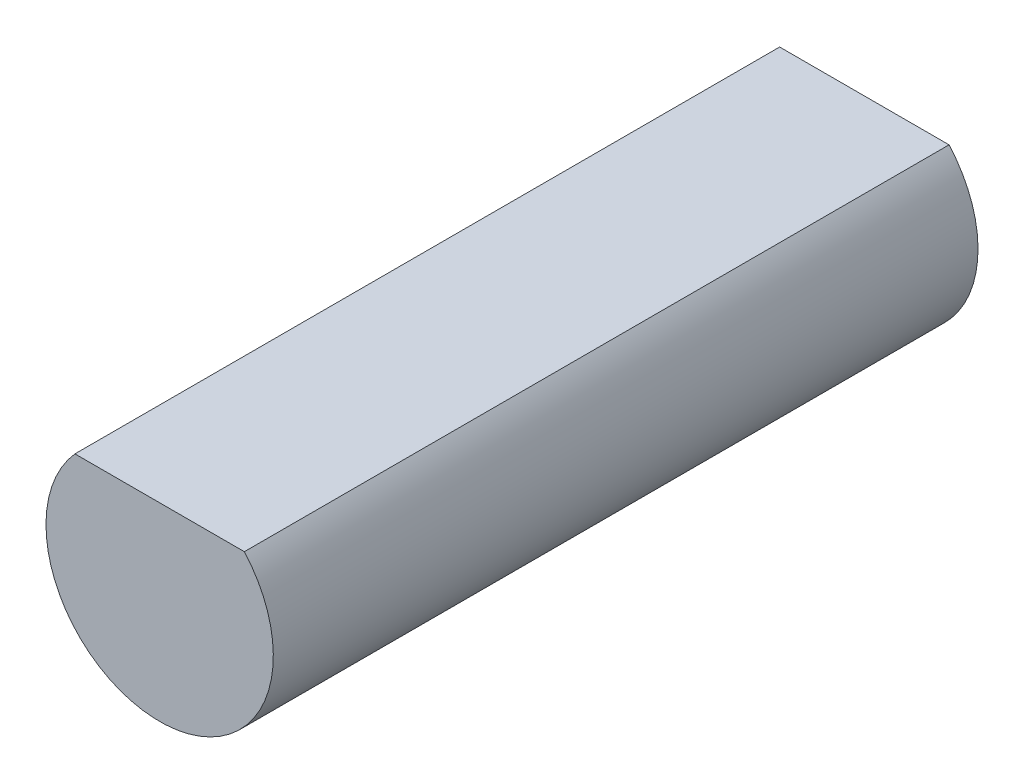
ISO-10303-21;
HEADER;
FILE_DESCRIPTION(('STEP AP214'),'2;1');
FILE_NAME('part.step','',(''),(''),'','','');
FILE_SCHEMA(('AUTOMOTIVE_DESIGN { 1 0 10303 214 1 1 1 1 }'));
ENDSEC;
DATA;
#1=APPLICATION_CONTEXT('core data for automotive mechanical design processes');
#2=APPLICATION_PROTOCOL_DEFINITION('international standard','automotive_design',2000,#1);
#3=PRODUCT_CONTEXT('',#1,'mechanical');
#4=PRODUCT('Part','Part','',(#3));
#5=PRODUCT_RELATED_PRODUCT_CATEGORY('part','',(#4));
#6=PRODUCT_DEFINITION_FORMATION('','',#4);
#7=PRODUCT_DEFINITION_CONTEXT('part definition',#1,'design');
#8=PRODUCT_DEFINITION('design','',#6,#7);
#9=PRODUCT_DEFINITION_SHAPE('','',#8);
#10=(LENGTH_UNIT() NAMED_UNIT(*) SI_UNIT(.MILLI.,.METRE.));
#11=(NAMED_UNIT(*) PLANE_ANGLE_UNIT() SI_UNIT($,.RADIAN.));
#12=(NAMED_UNIT(*) SI_UNIT($,.STERADIAN.) SOLID_ANGLE_UNIT());
#13=UNCERTAINTY_MEASURE_WITH_UNIT(LENGTH_MEASURE(1.E-05),#10,'distance_accuracy_value','');
#14=(GEOMETRIC_REPRESENTATION_CONTEXT(3) GLOBAL_UNCERTAINTY_ASSIGNED_CONTEXT((#13)) GLOBAL_UNIT_ASSIGNED_CONTEXT((#10,
#11,#12)) REPRESENTATION_CONTEXT('',''));
#15=CARTESIAN_POINT('',(0.,0.,0.));
#16=DIRECTION('',(0.,0.,1.));
#17=DIRECTION('',(1.,0.,0.));
#18=AXIS2_PLACEMENT_3D('',#15,#16,#17);
#19=CARTESIAN_POINT('',(0.,0.,9.3));
#20=DIRECTION('',(0.,0.,-1.));
#21=DIRECTION('',(-1.,0.,0.));
#22=AXIS2_PLACEMENT_3D('',#19,#20,#21);
#23=CYLINDRICAL_SURFACE('',#22,1.5);
#24=CARTESIAN_POINT('',(0.,0.,0.));
#25=DIRECTION('',(0.,0.,1.));
#26=DIRECTION('',(1.,0.,0.));
#27=AXIS2_PLACEMENT_3D('',#24,#25,#26);
#28=CIRCLE('',#27,1.5);
#29=CARTESIAN_POINT('',(-1.11803398874989,1.,0.));
#30=VERTEX_POINT('',#29);
#31=CARTESIAN_POINT('',(1.11803398874989,1.,0.));
#32=VERTEX_POINT('',#31);
#33=EDGE_CURVE('E67',#30,#32,#28,.T.);
#34=ORIENTED_EDGE('',*,*,#33,.T.);
#35=DIRECTION('',(0.,0.,-1.));
#36=VECTOR('',#35,1.);
#37=CARTESIAN_POINT('',(1.11803398874989,1.,9.3));
#38=LINE('',#37,#36);
#39=CARTESIAN_POINT('',(1.11803398874989,1.,9.3));
#40=VERTEX_POINT('',#39);
#41=EDGE_CURVE('E11',#40,#32,#38,.T.);
#42=ORIENTED_EDGE('',*,*,#41,.F.);
#43=CARTESIAN_POINT('',(0.,0.,9.3));
#44=DIRECTION('',(0.,0.,1.));
#45=DIRECTION('',(1.,0.,0.));
#46=AXIS2_PLACEMENT_3D('',#43,#44,#45);
#47=CIRCLE('',#46,1.5);
#48=CARTESIAN_POINT('',(-1.11803398874989,1.,9.3));
#49=VERTEX_POINT('',#48);
#50=EDGE_CURVE('E66',#49,#40,#47,.T.);
#51=ORIENTED_EDGE('',*,*,#50,.F.);
#52=DIRECTION('',(0.,0.,-1.));
#53=VECTOR('',#52,1.);
#54=CARTESIAN_POINT('',(-1.11803398874989,1.,9.3));
#55=LINE('',#54,#53);
#56=EDGE_CURVE('E44',#49,#30,#55,.T.);
#57=ORIENTED_EDGE('',*,*,#56,.T.);
#58=EDGE_LOOP('',(#34,#42,#51,#57));
#59=FACE_BOUND('',#58,.T.);
#60=ADVANCED_FACE('F36',(#59),#23,.T.);
#61=CARTESIAN_POINT('',(-1.11803398874989,1.,9.3));
#62=DIRECTION('',(0.,-1.,0.));
#63=DIRECTION('',(0.,0.,-1.));
#64=AXIS2_PLACEMENT_3D('',#61,#62,#63);
#65=PLANE('',#64);
#66=DIRECTION('',(-1.,0.,0.));
#67=VECTOR('',#66,1.);
#68=CARTESIAN_POINT('',(-1.11803398874989,1.,0.));
#69=LINE('',#68,#67);
#70=EDGE_CURVE('E59',#32,#30,#69,.T.);
#71=ORIENTED_EDGE('',*,*,#70,.T.);
#72=ORIENTED_EDGE('',*,*,#56,.F.);
#73=DIRECTION('',(-1.,0.,0.));
#74=VECTOR('',#73,1.);
#75=CARTESIAN_POINT('',(-1.11803398874989,1.,9.3));
#76=LINE('',#75,#74);
#77=EDGE_CURVE('E51',#40,#49,#76,.T.);
#78=ORIENTED_EDGE('',*,*,#77,.F.);
#79=ORIENTED_EDGE('',*,*,#41,.T.);
#80=EDGE_LOOP('',(#71,#72,#78,#79));
#81=FACE_BOUND('',#80,.T.);
#82=ADVANCED_FACE('F62',(#81),#65,.F.);
#83=CARTESIAN_POINT('',(0.,0.,9.3));
#84=DIRECTION('',(0.,0.,1.));
#85=DIRECTION('',(1.,0.,0.));
#86=AXIS2_PLACEMENT_3D('',#83,#84,#85);
#87=PLANE('',#86);
#88=ORIENTED_EDGE('',*,*,#50,.T.);
#89=ORIENTED_EDGE('',*,*,#77,.T.);
#90=EDGE_LOOP('',(#88,#89));
#91=FACE_BOUND('',#90,.T.);
#92=ADVANCED_FACE('F74',(#91),#87,.T.);
#93=CARTESIAN_POINT('',(0.,0.,0.));
#94=DIRECTION('',(0.,0.,1.));
#95=DIRECTION('',(1.,0.,0.));
#96=AXIS2_PLACEMENT_3D('',#93,#94,#95);
#97=PLANE('',#96);
#98=ORIENTED_EDGE('',*,*,#33,.F.);
#99=ORIENTED_EDGE('',*,*,#70,.F.);
#100=EDGE_LOOP('',(#98,#99));
#101=FACE_BOUND('',#100,.T.);
#102=ADVANCED_FACE('F70',(#101),#97,.F.);
#103=CLOSED_SHELL('',(#60,#82,#92,#102));
#104=MANIFOLD_SOLID_BREP('B2',#103);
#105=ADVANCED_BREP_SHAPE_REPRESENTATION('',(#18,#104),#14);
#106=SHAPE_DEFINITION_REPRESENTATION(#9,#105);
ENDSEC;
END-ISO-10303-21;
